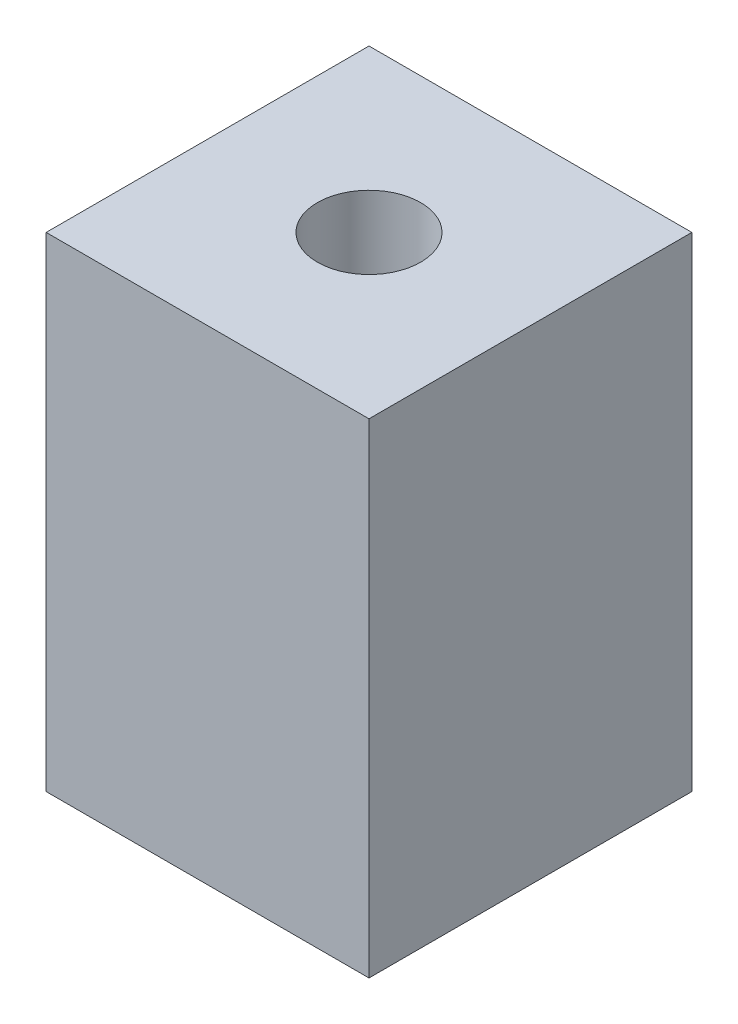
ISO-10303-21;
HEADER;
FILE_DESCRIPTION(('STEP AP214'),'2;1');
FILE_NAME('part.step','',(''),(''),'','','');
FILE_SCHEMA(('AUTOMOTIVE_DESIGN { 1 0 10303 214 1 1 1 1 }'));
ENDSEC;
DATA;
#1=APPLICATION_CONTEXT('core data for automotive mechanical design processes');
#2=APPLICATION_PROTOCOL_DEFINITION('international standard','automotive_design',2000,#1);
#3=PRODUCT_CONTEXT('',#1,'mechanical');
#4=PRODUCT('Part','Part','',(#3));
#5=PRODUCT_RELATED_PRODUCT_CATEGORY('part','',(#4));
#6=PRODUCT_DEFINITION_FORMATION('','',#4);
#7=PRODUCT_DEFINITION_CONTEXT('part definition',#1,'design');
#8=PRODUCT_DEFINITION('design','',#6,#7);
#9=PRODUCT_DEFINITION_SHAPE('','',#8);
#10=(LENGTH_UNIT() NAMED_UNIT(*) SI_UNIT(.MILLI.,.METRE.));
#11=(NAMED_UNIT(*) PLANE_ANGLE_UNIT() SI_UNIT($,.RADIAN.));
#12=(NAMED_UNIT(*) SI_UNIT($,.STERADIAN.) SOLID_ANGLE_UNIT());
#13=UNCERTAINTY_MEASURE_WITH_UNIT(LENGTH_MEASURE(1.E-05),#10,'distance_accuracy_value','');
#14=(GEOMETRIC_REPRESENTATION_CONTEXT(3) GLOBAL_UNCERTAINTY_ASSIGNED_CONTEXT((#13)) GLOBAL_UNIT_ASSIGNED_CONTEXT((#10,
#11,#12)) REPRESENTATION_CONTEXT('',''));
#15=CARTESIAN_POINT('',(0.,0.,0.));
#16=DIRECTION('',(0.,0.,1.));
#17=DIRECTION('',(1.,0.,0.));
#18=AXIS2_PLACEMENT_3D('',#15,#16,#17);
#19=CARTESIAN_POINT('',(-20.,30.,-10.));
#20=DIRECTION('',(1.,0.,0.));
#21=DIRECTION('',(0.,0.,-1.));
#22=AXIS2_PLACEMENT_3D('',#19,#20,#21);
#23=PLANE('',#22);
#24=DIRECTION('',(0.,0.,1.));
#25=VECTOR('',#24,1.);
#26=CARTESIAN_POINT('',(-20.,0.,-10.));
#27=LINE('',#26,#25);
#28=CARTESIAN_POINT('',(-20.,0.,-10.));
#29=VERTEX_POINT('',#28);
#30=CARTESIAN_POINT('',(-20.,0.,10.));
#31=VERTEX_POINT('',#30);
#32=EDGE_CURVE('E113',#29,#31,#27,.T.);
#33=ORIENTED_EDGE('',*,*,#32,.T.);
#34=DIRECTION('',(0.,-1.,0.));
#35=VECTOR('',#34,1.);
#36=CARTESIAN_POINT('',(-20.,30.,10.));
#37=LINE('',#36,#35);
#38=CARTESIAN_POINT('',(-20.,30.,10.));
#39=VERTEX_POINT('',#38);
#40=EDGE_CURVE('E11',#39,#31,#37,.T.);
#41=ORIENTED_EDGE('',*,*,#40,.F.);
#42=DIRECTION('',(0.,0.,1.));
#43=VECTOR('',#42,1.);
#44=CARTESIAN_POINT('',(-20.,30.,-10.));
#45=LINE('',#44,#43);
#46=CARTESIAN_POINT('',(-20.,30.,-10.));
#47=VERTEX_POINT('',#46);
#48=EDGE_CURVE('E97',#47,#39,#45,.T.);
#49=ORIENTED_EDGE('',*,*,#48,.F.);
#50=DIRECTION('',(0.,-1.,0.));
#51=VECTOR('',#50,1.);
#52=CARTESIAN_POINT('',(-20.,30.,-10.));
#53=LINE('',#52,#51);
#54=EDGE_CURVE('E109',#47,#29,#53,.T.);
#55=ORIENTED_EDGE('',*,*,#54,.T.);
#56=EDGE_LOOP('',(#33,#41,#49,#55));
#57=FACE_BOUND('',#56,.T.);
#58=ADVANCED_FACE('F45',(#57),#23,.F.);
#59=CARTESIAN_POINT('',(-20.,30.,10.));
#60=DIRECTION('',(0.,0.,-1.));
#61=DIRECTION('',(-1.,0.,0.));
#62=AXIS2_PLACEMENT_3D('',#59,#60,#61);
#63=PLANE('',#62);
#64=DIRECTION('',(1.,0.,0.));
#65=VECTOR('',#64,1.);
#66=CARTESIAN_POINT('',(-20.,0.,10.));
#67=LINE('',#66,#65);
#68=CARTESIAN_POINT('',(0.,0.,10.));
#69=VERTEX_POINT('',#68);
#70=EDGE_CURVE('E102',#31,#69,#67,.T.);
#71=ORIENTED_EDGE('',*,*,#70,.T.);
#72=DIRECTION('',(0.,-1.,0.));
#73=VECTOR('',#72,1.);
#74=CARTESIAN_POINT('',(0.,30.,10.));
#75=LINE('',#74,#73);
#76=CARTESIAN_POINT('',(0.,30.,10.));
#77=VERTEX_POINT('',#76);
#78=EDGE_CURVE('E54',#77,#69,#75,.T.);
#79=ORIENTED_EDGE('',*,*,#78,.F.);
#80=DIRECTION('',(1.,0.,0.));
#81=VECTOR('',#80,1.);
#82=CARTESIAN_POINT('',(-20.,30.,10.));
#83=LINE('',#82,#81);
#84=EDGE_CURVE('E92',#39,#77,#83,.T.);
#85=ORIENTED_EDGE('',*,*,#84,.F.);
#86=ORIENTED_EDGE('',*,*,#40,.T.);
#87=EDGE_LOOP('',(#71,#79,#85,#86));
#88=FACE_BOUND('',#87,.T.);
#89=ADVANCED_FACE('F101',(#88),#63,.F.);
#90=CARTESIAN_POINT('',(0.,30.,-10.));
#91=DIRECTION('',(-1.,0.,0.));
#92=DIRECTION('',(0.,0.,1.));
#93=AXIS2_PLACEMENT_3D('',#90,#91,#92);
#94=PLANE('',#93);
#95=DIRECTION('',(0.,0.,-1.));
#96=VECTOR('',#95,1.);
#97=CARTESIAN_POINT('',(0.,0.,-10.));
#98=LINE('',#97,#96);
#99=CARTESIAN_POINT('',(0.,0.,-10.));
#100=VERTEX_POINT('',#99);
#101=EDGE_CURVE('E79',#69,#100,#98,.T.);
#102=ORIENTED_EDGE('',*,*,#101,.T.);
#103=DIRECTION('',(0.,-1.,0.));
#104=VECTOR('',#103,1.);
#105=CARTESIAN_POINT('',(0.,30.,-10.));
#106=LINE('',#105,#104);
#107=CARTESIAN_POINT('',(0.,30.,-10.));
#108=VERTEX_POINT('',#107);
#109=EDGE_CURVE('E104',#108,#100,#106,.T.);
#110=ORIENTED_EDGE('',*,*,#109,.F.);
#111=DIRECTION('',(0.,0.,-1.));
#112=VECTOR('',#111,1.);
#113=CARTESIAN_POINT('',(0.,30.,-10.));
#114=LINE('',#113,#112);
#115=EDGE_CURVE('E95',#77,#108,#114,.T.);
#116=ORIENTED_EDGE('',*,*,#115,.F.);
#117=ORIENTED_EDGE('',*,*,#78,.T.);
#118=EDGE_LOOP('',(#102,#110,#116,#117));
#119=FACE_BOUND('',#118,.T.);
#120=ADVANCED_FACE('F105',(#119),#94,.F.);
#121=CARTESIAN_POINT('',(-20.,30.,-10.));
#122=DIRECTION('',(0.,0.,1.));
#123=DIRECTION('',(1.,0.,0.));
#124=AXIS2_PLACEMENT_3D('',#121,#122,#123);
#125=PLANE('',#124);
#126=DIRECTION('',(-1.,0.,0.));
#127=VECTOR('',#126,1.);
#128=CARTESIAN_POINT('',(-20.,0.,-10.));
#129=LINE('',#128,#127);
#130=EDGE_CURVE('E85',#100,#29,#129,.T.);
#131=ORIENTED_EDGE('',*,*,#130,.T.);
#132=ORIENTED_EDGE('',*,*,#54,.F.);
#133=DIRECTION('',(-1.,0.,0.));
#134=VECTOR('',#133,1.);
#135=CARTESIAN_POINT('',(-20.,30.,-10.));
#136=LINE('',#135,#134);
#137=EDGE_CURVE('E62',#108,#47,#136,.T.);
#138=ORIENTED_EDGE('',*,*,#137,.F.);
#139=ORIENTED_EDGE('',*,*,#109,.T.);
#140=EDGE_LOOP('',(#131,#132,#138,#139));
#141=FACE_BOUND('',#140,.T.);
#142=ADVANCED_FACE('F127',(#141),#125,.F.);
#143=CARTESIAN_POINT('',(0.,30.,0.));
#144=DIRECTION('',(0.,1.,0.));
#145=DIRECTION('',(0.,0.,1.));
#146=AXIS2_PLACEMENT_3D('',#143,#144,#145);
#147=PLANE('',#146);
#148=CARTESIAN_POINT('',(-10.,30.,0.));
#149=DIRECTION('',(0.,1.,0.));
#150=DIRECTION('',(0.,0.,1.));
#151=AXIS2_PLACEMENT_3D('',#148,#149,#150);
#152=CIRCLE('',#151,3.2);
#153=CARTESIAN_POINT('',(-10.,30.,3.2));
#154=VERTEX_POINT('',#153);
#155=EDGE_CURVE('E134',#154,#154,#152,.T.);
#156=ORIENTED_EDGE('',*,*,#155,.F.);
#157=EDGE_LOOP('',(#156));
#158=FACE_BOUND('',#157,.T.);
#159=ORIENTED_EDGE('',*,*,#48,.T.);
#160=ORIENTED_EDGE('',*,*,#84,.T.);
#161=ORIENTED_EDGE('',*,*,#115,.T.);
#162=ORIENTED_EDGE('',*,*,#137,.T.);
#163=EDGE_LOOP('',(#159,#160,#161,#162));
#164=FACE_BOUND('',#163,.T.);
#165=ADVANCED_FACE('F93',(#158,#164),#147,.T.);
#166=CARTESIAN_POINT('',(0.,0.,0.));
#167=DIRECTION('',(0.,1.,0.));
#168=DIRECTION('',(0.,0.,1.));
#169=AXIS2_PLACEMENT_3D('',#166,#167,#168);
#170=PLANE('',#169);
#171=CARTESIAN_POINT('',(-10.,0.,0.));
#172=DIRECTION('',(0.,1.,0.));
#173=DIRECTION('',(0.,0.,1.));
#174=AXIS2_PLACEMENT_3D('',#171,#172,#173);
#175=CIRCLE('',#174,3.2);
#176=CARTESIAN_POINT('',(-10.,0.,3.2));
#177=VERTEX_POINT('',#176);
#178=EDGE_CURVE('E117',#177,#177,#175,.T.);
#179=ORIENTED_EDGE('',*,*,#178,.T.);
#180=EDGE_LOOP('',(#179));
#181=FACE_BOUND('',#180,.T.);
#182=ORIENTED_EDGE('',*,*,#32,.F.);
#183=ORIENTED_EDGE('',*,*,#130,.F.);
#184=ORIENTED_EDGE('',*,*,#101,.F.);
#185=ORIENTED_EDGE('',*,*,#70,.F.);
#186=EDGE_LOOP('',(#182,#183,#184,#185));
#187=FACE_BOUND('',#186,.T.);
#188=ADVANCED_FACE('F130',(#181,#187),#170,.F.);
#189=CARTESIAN_POINT('',(-10.,0.,0.));
#190=DIRECTION('',(0.,1.,0.));
#191=DIRECTION('',(0.,0.,1.));
#192=AXIS2_PLACEMENT_3D('',#189,#190,#191);
#193=CYLINDRICAL_SURFACE('',#192,3.2);
#194=ORIENTED_EDGE('',*,*,#178,.F.);
#195=EDGE_LOOP('',(#194));
#196=FACE_BOUND('',#195,.T.);
#197=ORIENTED_EDGE('',*,*,#155,.T.);
#198=EDGE_LOOP('',(#197));
#199=FACE_BOUND('',#198,.T.);
#200=ADVANCED_FACE('F143',(#196,#199),#193,.F.);
#201=CLOSED_SHELL('',(#58,#89,#120,#142,#165,#188,#200));
#202=MANIFOLD_SOLID_BREP('B2',#201);
#203=ADVANCED_BREP_SHAPE_REPRESENTATION('',(#18,#202),#14);
#204=SHAPE_DEFINITION_REPRESENTATION(#9,#203);
ENDSEC;
END-ISO-10303-21;
